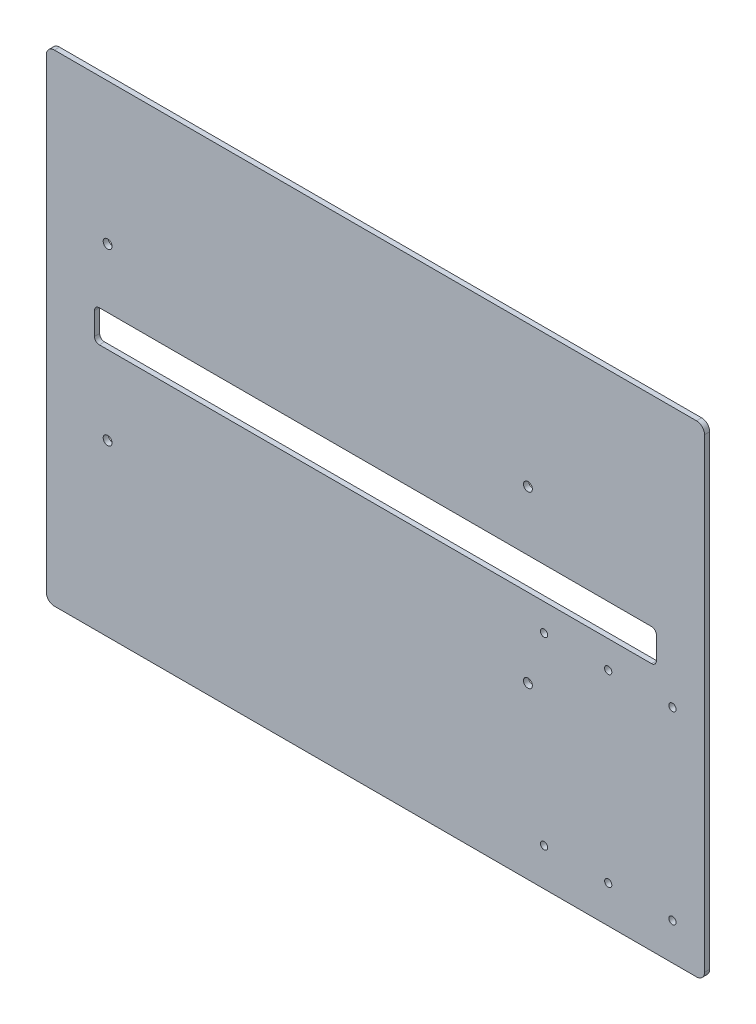
ISO-10303-21;
HEADER;
FILE_DESCRIPTION(('STEP AP214'),'2;1');
FILE_NAME('part.step','',(''),(''),'','','');
FILE_SCHEMA(('AUTOMOTIVE_DESIGN { 1 0 10303 214 1 1 1 1 }'));
ENDSEC;
DATA;
#1=APPLICATION_CONTEXT('core data for automotive mechanical design processes');
#2=APPLICATION_PROTOCOL_DEFINITION('international standard','automotive_design',2000,#1);
#3=PRODUCT_CONTEXT('',#1,'mechanical');
#4=PRODUCT('Part','Part','',(#3));
#5=PRODUCT_RELATED_PRODUCT_CATEGORY('part','',(#4));
#6=PRODUCT_DEFINITION_FORMATION('','',#4);
#7=PRODUCT_DEFINITION_CONTEXT('part definition',#1,'design');
#8=PRODUCT_DEFINITION('design','',#6,#7);
#9=PRODUCT_DEFINITION_SHAPE('','',#8);
#10=(LENGTH_UNIT() NAMED_UNIT(*) SI_UNIT(.MILLI.,.METRE.));
#11=(NAMED_UNIT(*) PLANE_ANGLE_UNIT() SI_UNIT($,.RADIAN.));
#12=(NAMED_UNIT(*) SI_UNIT($,.STERADIAN.) SOLID_ANGLE_UNIT());
#13=UNCERTAINTY_MEASURE_WITH_UNIT(LENGTH_MEASURE(1.E-05),#10,'distance_accuracy_value','');
#14=(GEOMETRIC_REPRESENTATION_CONTEXT(3) GLOBAL_UNCERTAINTY_ASSIGNED_CONTEXT((#13)) GLOBAL_UNIT_ASSIGNED_CONTEXT((#10,
#11,#12)) REPRESENTATION_CONTEXT('',''));
#15=CARTESIAN_POINT('',(0.,0.,0.));
#16=DIRECTION('',(0.,0.,1.));
#17=DIRECTION('',(1.,0.,0.));
#18=AXIS2_PLACEMENT_3D('',#15,#16,#17);
#19=CARTESIAN_POINT('',(5.,5.,3.2));
#20=DIRECTION('',(0.,0.,-1.));
#21=DIRECTION('',(-1.,0.,0.));
#22=AXIS2_PLACEMENT_3D('',#19,#20,#21);
#23=PLANE('',#22);
#24=CARTESIAN_POINT('',(300.,212.,3.2));
#25=DIRECTION('',(0.,0.,1.));
#26=DIRECTION('',(1.,0.,0.));
#27=AXIS2_PLACEMENT_3D('',#24,#25,#26);
#28=CIRCLE('',#27,2.74999999999998);
#29=CARTESIAN_POINT('',(302.75,212.,3.2));
#30=VERTEX_POINT('',#29);
#31=EDGE_CURVE('E246',#30,#30,#28,.T.);
#32=ORIENTED_EDGE('',*,*,#31,.F.);
#33=EDGE_LOOP('',(#32));
#34=FACE_BOUND('',#33,.T.);
#35=CARTESIAN_POINT('',(38.17,212.,3.2));
#36=DIRECTION('',(0.,0.,1.));
#37=DIRECTION('',(1.,0.,0.));
#38=AXIS2_PLACEMENT_3D('',#35,#36,#37);
#39=CIRCLE('',#38,2.75);
#40=CARTESIAN_POINT('',(40.92,212.,3.2));
#41=VERTEX_POINT('',#40);
#42=EDGE_CURVE('E253',#41,#41,#39,.T.);
#43=ORIENTED_EDGE('',*,*,#42,.F.);
#44=EDGE_LOOP('',(#43));
#45=FACE_BOUND('',#44,.T.);
#46=CARTESIAN_POINT('',(38.17,106.,3.2));
#47=DIRECTION('',(0.,0.,1.));
#48=DIRECTION('',(1.,0.,0.));
#49=AXIS2_PLACEMENT_3D('',#46,#47,#48);
#50=CIRCLE('',#49,2.75);
#51=CARTESIAN_POINT('',(40.92,106.,3.2));
#52=VERTEX_POINT('',#51);
#53=EDGE_CURVE('E261',#52,#52,#50,.T.);
#54=ORIENTED_EDGE('',*,*,#53,.F.);
#55=EDGE_LOOP('',(#54));
#56=FACE_BOUND('',#55,.T.);
#57=CARTESIAN_POINT('',(300.,106.,3.2));
#58=DIRECTION('',(0.,0.,1.));
#59=DIRECTION('',(1.,0.,0.));
#60=AXIS2_PLACEMENT_3D('',#57,#58,#59);
#61=CIRCLE('',#60,2.74999999999998);
#62=CARTESIAN_POINT('',(302.75,106.,3.2));
#63=VERTEX_POINT('',#62);
#64=EDGE_CURVE('E269',#63,#63,#61,.T.);
#65=ORIENTED_EDGE('',*,*,#64,.F.);
#66=EDGE_LOOP('',(#65));
#67=FACE_BOUND('',#66,.T.);
#68=CARTESIAN_POINT('',(390.,137.974344645562,3.2));
#69=DIRECTION('',(0.,0.,1.));
#70=DIRECTION('',(1.,0.,0.));
#71=AXIS2_PLACEMENT_3D('',#68,#69,#70);
#72=CIRCLE('',#71,2.24999999999996);
#73=CARTESIAN_POINT('',(392.25,137.974344645562,3.2));
#74=VERTEX_POINT('',#73);
#75=EDGE_CURVE('E277',#74,#74,#72,.T.);
#76=ORIENTED_EDGE('',*,*,#75,.F.);
#77=EDGE_LOOP('',(#76));
#78=FACE_BOUND('',#77,.T.);
#79=CARTESIAN_POINT('',(350.,137.974344645562,3.2));
#80=DIRECTION('',(0.,0.,1.));
#81=DIRECTION('',(1.,0.,0.));
#82=AXIS2_PLACEMENT_3D('',#79,#80,#81);
#83=CIRCLE('',#82,2.24999999999996);
#84=CARTESIAN_POINT('',(352.25,137.974344645562,3.2));
#85=VERTEX_POINT('',#84);
#86=EDGE_CURVE('E285',#85,#85,#83,.T.);
#87=ORIENTED_EDGE('',*,*,#86,.F.);
#88=EDGE_LOOP('',(#87));
#89=FACE_BOUND('',#88,.T.);
#90=CARTESIAN_POINT('',(310.,137.974344645562,3.2));
#91=DIRECTION('',(0.,0.,1.));
#92=DIRECTION('',(1.,0.,0.));
#93=AXIS2_PLACEMENT_3D('',#90,#91,#92);
#94=CIRCLE('',#93,2.24999999999996);
#95=CARTESIAN_POINT('',(312.25,137.974344645562,3.2));
#96=VERTEX_POINT('',#95);
#97=EDGE_CURVE('E293',#96,#96,#94,.T.);
#98=ORIENTED_EDGE('',*,*,#97,.F.);
#99=EDGE_LOOP('',(#98));
#100=FACE_BOUND('',#99,.T.);
#101=CARTESIAN_POINT('',(390.,22.9743446455618,3.2));
#102=DIRECTION('',(0.,0.,1.));
#103=DIRECTION('',(1.,0.,0.));
#104=AXIS2_PLACEMENT_3D('',#101,#102,#103);
#105=CIRCLE('',#104,2.24999999999995);
#106=CARTESIAN_POINT('',(392.25,22.9743446455618,3.2));
#107=VERTEX_POINT('',#106);
#108=EDGE_CURVE('E301',#107,#107,#105,.T.);
#109=ORIENTED_EDGE('',*,*,#108,.F.);
#110=EDGE_LOOP('',(#109));
#111=FACE_BOUND('',#110,.T.);
#112=CARTESIAN_POINT('',(350.,23.1568874107764,3.2));
#113=DIRECTION('',(0.,0.,1.));
#114=DIRECTION('',(1.,0.,0.));
#115=AXIS2_PLACEMENT_3D('',#112,#113,#114);
#116=CIRCLE('',#115,2.24999999999995);
#117=CARTESIAN_POINT('',(352.25,23.1568874107764,3.2));
#118=VERTEX_POINT('',#117);
#119=EDGE_CURVE('E308',#118,#118,#116,.T.);
#120=ORIENTED_EDGE('',*,*,#119,.F.);
#121=EDGE_LOOP('',(#120));
#122=FACE_BOUND('',#121,.T.);
#123=CARTESIAN_POINT('',(310.,23.3394301759909,3.2));
#124=DIRECTION('',(0.,0.,1.));
#125=DIRECTION('',(1.,0.,0.));
#126=AXIS2_PLACEMENT_3D('',#123,#124,#125);
#127=CIRCLE('',#126,2.24999999999995);
#128=CARTESIAN_POINT('',(312.25,23.3394301759909,3.2));
#129=VERTEX_POINT('',#128);
#130=EDGE_CURVE('E316',#129,#129,#127,.T.);
#131=ORIENTED_EDGE('',*,*,#130,.F.);
#132=EDGE_LOOP('',(#131));
#133=FACE_BOUND('',#132,.T.);
#134=CARTESIAN_POINT('',(5.,5.,3.2));
#135=DIRECTION('',(0.,0.,1.));
#136=DIRECTION('',(-1.,0.,0.));
#137=AXIS2_PLACEMENT_3D('',#134,#135,#136);
#138=CIRCLE('',#137,5.);
#139=CARTESIAN_POINT('',(0.,5.00000000000004,3.2));
#140=VERTEX_POINT('',#139);
#141=CARTESIAN_POINT('',(5.00000000000003,0.,3.2));
#142=VERTEX_POINT('',#141);
#143=EDGE_CURVE('E324',#140,#142,#138,.T.);
#144=ORIENTED_EDGE('',*,*,#143,.T.);
#145=DIRECTION('',(1.,0.,0.));
#146=VECTOR('',#145,1.);
#147=CARTESIAN_POINT('',(5.00000000000003,0.,3.2));
#148=LINE('',#147,#146);
#149=CARTESIAN_POINT('',(405.,0.,3.2));
#150=VERTEX_POINT('',#149);
#151=EDGE_CURVE('E328',#142,#150,#148,.T.);
#152=ORIENTED_EDGE('',*,*,#151,.T.);
#153=CARTESIAN_POINT('',(405.,5.,3.2));
#154=DIRECTION('',(0.,0.,1.));
#155=DIRECTION('',(1.,0.,0.));
#156=AXIS2_PLACEMENT_3D('',#153,#154,#155);
#157=CIRCLE('',#156,5.);
#158=CARTESIAN_POINT('',(410.,5.,3.2));
#159=VERTEX_POINT('',#158);
#160=EDGE_CURVE('E332',#150,#159,#157,.T.);
#161=ORIENTED_EDGE('',*,*,#160,.T.);
#162=DIRECTION('',(0.,1.,0.));
#163=VECTOR('',#162,1.);
#164=CARTESIAN_POINT('',(410.,5.00000000000004,3.2));
#165=LINE('',#164,#163);
#166=CARTESIAN_POINT('',(410.,295.,3.2));
#167=VERTEX_POINT('',#166);
#168=EDGE_CURVE('E335',#159,#167,#165,.T.);
#169=ORIENTED_EDGE('',*,*,#168,.T.);
#170=CARTESIAN_POINT('',(405.,295.,3.2));
#171=DIRECTION('',(0.,0.,1.));
#172=DIRECTION('',(-1.,0.,0.));
#173=AXIS2_PLACEMENT_3D('',#170,#171,#172);
#174=CIRCLE('',#173,5.);
#175=CARTESIAN_POINT('',(405.,300.,3.2));
#176=VERTEX_POINT('',#175);
#177=EDGE_CURVE('E338',#167,#176,#174,.T.);
#178=ORIENTED_EDGE('',*,*,#177,.T.);
#179=DIRECTION('',(-1.,0.,0.));
#180=VECTOR('',#179,1.);
#181=CARTESIAN_POINT('',(5.00000000000003,300.,3.2));
#182=LINE('',#181,#180);
#183=CARTESIAN_POINT('',(5.00000000000003,300.,3.2));
#184=VERTEX_POINT('',#183);
#185=EDGE_CURVE('E341',#176,#184,#182,.T.);
#186=ORIENTED_EDGE('',*,*,#185,.T.);
#187=CARTESIAN_POINT('',(5.,295.,3.2));
#188=DIRECTION('',(0.,0.,1.));
#189=DIRECTION('',(-1.,0.,0.));
#190=AXIS2_PLACEMENT_3D('',#187,#188,#189);
#191=CIRCLE('',#190,5.);
#192=CARTESIAN_POINT('',(0.,295.,3.2));
#193=VERTEX_POINT('',#192);
#194=EDGE_CURVE('E344',#184,#193,#191,.T.);
#195=ORIENTED_EDGE('',*,*,#194,.T.);
#196=DIRECTION('',(0.,-1.,0.));
#197=VECTOR('',#196,1.);
#198=CARTESIAN_POINT('',(0.,5.00000000000004,3.2));
#199=LINE('',#198,#197);
#200=EDGE_CURVE('E347',#193,#140,#199,.T.);
#201=ORIENTED_EDGE('',*,*,#200,.T.);
#202=EDGE_LOOP('',(#144,#152,#161,#169,#178,#186,#195,#201));
#203=FACE_BOUND('',#202,.T.);
#204=CARTESIAN_POINT('',(377.,158.,3.2));
#205=DIRECTION('',(0.,0.,1.));
#206=DIRECTION('',(1.,0.,0.));
#207=AXIS2_PLACEMENT_3D('',#204,#205,#206);
#208=CIRCLE('',#207,3.);
#209=CARTESIAN_POINT('',(377.,155.,3.2));
#210=VERTEX_POINT('',#209);
#211=CARTESIAN_POINT('',(380.,158.,3.2));
#212=VERTEX_POINT('',#211);
#213=EDGE_CURVE('E154',#210,#212,#208,.T.);
#214=ORIENTED_EDGE('',*,*,#213,.F.);
#215=DIRECTION('',(1.,0.,0.));
#216=VECTOR('',#215,1.);
#217=CARTESIAN_POINT('',(33.,155.,3.2));
#218=LINE('',#217,#216);
#219=CARTESIAN_POINT('',(33.,155.,3.2));
#220=VERTEX_POINT('',#219);
#221=EDGE_CURVE('E198',#220,#210,#218,.T.);
#222=ORIENTED_EDGE('',*,*,#221,.F.);
#223=CARTESIAN_POINT('',(33.,158.,3.2));
#224=DIRECTION('',(0.,0.,1.));
#225=DIRECTION('',(-1.,0.,0.));
#226=AXIS2_PLACEMENT_3D('',#223,#224,#225);
#227=CIRCLE('',#226,3.);
#228=CARTESIAN_POINT('',(30.,158.,3.2));
#229=VERTEX_POINT('',#228);
#230=EDGE_CURVE('E195',#229,#220,#227,.T.);
#231=ORIENTED_EDGE('',*,*,#230,.F.);
#232=DIRECTION('',(0.,-1.,0.));
#233=VECTOR('',#232,1.);
#234=CARTESIAN_POINT('',(30.,158.,3.2));
#235=LINE('',#234,#233);
#236=CARTESIAN_POINT('',(30.,172.,3.2));
#237=VERTEX_POINT('',#236);
#238=EDGE_CURVE('E192',#237,#229,#235,.T.);
#239=ORIENTED_EDGE('',*,*,#238,.F.);
#240=CARTESIAN_POINT('',(33.,172.,3.2));
#241=DIRECTION('',(0.,0.,1.));
#242=DIRECTION('',(-1.,0.,0.));
#243=AXIS2_PLACEMENT_3D('',#240,#241,#242);
#244=CIRCLE('',#243,3.);
#245=CARTESIAN_POINT('',(33.,175.,3.2));
#246=VERTEX_POINT('',#245);
#247=EDGE_CURVE('E189',#246,#237,#244,.T.);
#248=ORIENTED_EDGE('',*,*,#247,.F.);
#249=DIRECTION('',(-1.,0.,0.));
#250=VECTOR('',#249,1.);
#251=CARTESIAN_POINT('',(33.,175.,3.2));
#252=LINE('',#251,#250);
#253=CARTESIAN_POINT('',(377.,175.,3.2));
#254=VERTEX_POINT('',#253);
#255=EDGE_CURVE('E184',#254,#246,#252,.T.);
#256=ORIENTED_EDGE('',*,*,#255,.F.);
#257=CARTESIAN_POINT('',(377.,172.,3.2));
#258=DIRECTION('',(0.,0.,1.));
#259=DIRECTION('',(-1.,0.,0.));
#260=AXIS2_PLACEMENT_3D('',#257,#258,#259);
#261=CIRCLE('',#260,3.);
#262=CARTESIAN_POINT('',(380.,172.,3.2));
#263=VERTEX_POINT('',#262);
#264=EDGE_CURVE('E177',#263,#254,#261,.T.);
#265=ORIENTED_EDGE('',*,*,#264,.F.);
#266=DIRECTION('',(0.,1.,0.));
#267=VECTOR('',#266,1.);
#268=CARTESIAN_POINT('',(380.,158.,3.2));
#269=LINE('',#268,#267);
#270=EDGE_CURVE('E163',#212,#263,#269,.T.);
#271=ORIENTED_EDGE('',*,*,#270,.F.);
#272=EDGE_LOOP('',(#214,#222,#231,#239,#248,#256,#265,#271));
#273=FACE_BOUND('',#272,.T.);
#274=ADVANCED_FACE('F40',(#34,#45,#56,#67,#78,#89,#100,#111,#122,#133,#203,#273),#23,.F.);
#275=CARTESIAN_POINT('',(5.,5.,0.));
#276=DIRECTION('',(0.,0.,-1.));
#277=DIRECTION('',(-1.,0.,0.));
#278=AXIS2_PLACEMENT_3D('',#275,#276,#277);
#279=PLANE('',#278);
#280=CARTESIAN_POINT('',(38.17,212.,0.));
#281=DIRECTION('',(0.,0.,1.));
#282=DIRECTION('',(1.,0.,0.));
#283=AXIS2_PLACEMENT_3D('',#280,#281,#282);
#284=CIRCLE('',#283,2.75);
#285=CARTESIAN_POINT('',(40.92,212.,0.));
#286=VERTEX_POINT('',#285);
#287=EDGE_CURVE('E249',#286,#286,#284,.T.);
#288=ORIENTED_EDGE('',*,*,#287,.T.);
#289=EDGE_LOOP('',(#288));
#290=FACE_BOUND('',#289,.T.);
#291=CARTESIAN_POINT('',(300.,106.,0.));
#292=DIRECTION('',(0.,0.,1.));
#293=DIRECTION('',(1.,0.,0.));
#294=AXIS2_PLACEMENT_3D('',#291,#292,#293);
#295=CIRCLE('',#294,2.74999999999998);
#296=CARTESIAN_POINT('',(302.75,106.,0.));
#297=VERTEX_POINT('',#296);
#298=EDGE_CURVE('E265',#297,#297,#295,.T.);
#299=ORIENTED_EDGE('',*,*,#298,.T.);
#300=EDGE_LOOP('',(#299));
#301=FACE_BOUND('',#300,.T.);
#302=CARTESIAN_POINT('',(350.,137.974344645562,0.));
#303=DIRECTION('',(0.,0.,1.));
#304=DIRECTION('',(1.,0.,0.));
#305=AXIS2_PLACEMENT_3D('',#302,#303,#304);
#306=CIRCLE('',#305,2.24999999999996);
#307=CARTESIAN_POINT('',(352.25,137.974344645562,0.));
#308=VERTEX_POINT('',#307);
#309=EDGE_CURVE('E281',#308,#308,#306,.T.);
#310=ORIENTED_EDGE('',*,*,#309,.T.);
#311=EDGE_LOOP('',(#310));
#312=FACE_BOUND('',#311,.T.);
#313=CARTESIAN_POINT('',(390.,22.9743446455618,0.));
#314=DIRECTION('',(0.,0.,1.));
#315=DIRECTION('',(1.,0.,0.));
#316=AXIS2_PLACEMENT_3D('',#313,#314,#315);
#317=CIRCLE('',#316,2.24999999999995);
#318=CARTESIAN_POINT('',(392.25,22.9743446455618,0.));
#319=VERTEX_POINT('',#318);
#320=EDGE_CURVE('E297',#319,#319,#317,.T.);
#321=ORIENTED_EDGE('',*,*,#320,.T.);
#322=EDGE_LOOP('',(#321));
#323=FACE_BOUND('',#322,.T.);
#324=CARTESIAN_POINT('',(310.,23.3394301759909,0.));
#325=DIRECTION('',(0.,0.,1.));
#326=DIRECTION('',(1.,0.,0.));
#327=AXIS2_PLACEMENT_3D('',#324,#325,#326);
#328=CIRCLE('',#327,2.24999999999995);
#329=CARTESIAN_POINT('',(312.25,23.3394301759909,0.));
#330=VERTEX_POINT('',#329);
#331=EDGE_CURVE('E312',#330,#330,#328,.T.);
#332=ORIENTED_EDGE('',*,*,#331,.T.);
#333=EDGE_LOOP('',(#332));
#334=FACE_BOUND('',#333,.T.);
#335=CARTESIAN_POINT('',(5.,5.,0.));
#336=DIRECTION('',(0.,0.,1.));
#337=DIRECTION('',(-1.,0.,0.));
#338=AXIS2_PLACEMENT_3D('',#335,#336,#337);
#339=CIRCLE('',#338,5.);
#340=CARTESIAN_POINT('',(0.,5.00000000000004,0.));
#341=VERTEX_POINT('',#340);
#342=CARTESIAN_POINT('',(5.00000000000003,0.,0.));
#343=VERTEX_POINT('',#342);
#344=EDGE_CURVE('E320',#341,#343,#339,.T.);
#345=ORIENTED_EDGE('',*,*,#344,.F.);
#346=DIRECTION('',(0.,-1.,0.));
#347=VECTOR('',#346,1.);
#348=CARTESIAN_POINT('',(0.,5.00000000000004,0.));
#349=LINE('',#348,#347);
#350=CARTESIAN_POINT('',(0.,295.,0.));
#351=VERTEX_POINT('',#350);
#352=EDGE_CURVE('E329',#351,#341,#349,.T.);
#353=ORIENTED_EDGE('',*,*,#352,.F.);
#354=CARTESIAN_POINT('',(5.,295.,0.));
#355=DIRECTION('',(0.,0.,1.));
#356=DIRECTION('',(-1.,0.,0.));
#357=AXIS2_PLACEMENT_3D('',#354,#355,#356);
#358=CIRCLE('',#357,5.);
#359=CARTESIAN_POINT('',(5.00000000000003,300.,0.));
#360=VERTEX_POINT('',#359);
#361=EDGE_CURVE('E369',#360,#351,#358,.T.);
#362=ORIENTED_EDGE('',*,*,#361,.F.);
#363=DIRECTION('',(-1.,0.,0.));
#364=VECTOR('',#363,1.);
#365=CARTESIAN_POINT('',(5.00000000000003,300.,0.));
#366=LINE('',#365,#364);
#367=CARTESIAN_POINT('',(405.,300.,0.));
#368=VERTEX_POINT('',#367);
#369=EDGE_CURVE('E366',#368,#360,#366,.T.);
#370=ORIENTED_EDGE('',*,*,#369,.F.);
#371=CARTESIAN_POINT('',(405.,295.,0.));
#372=DIRECTION('',(0.,0.,1.));
#373=DIRECTION('',(-1.,0.,0.));
#374=AXIS2_PLACEMENT_3D('',#371,#372,#373);
#375=CIRCLE('',#374,5.);
#376=CARTESIAN_POINT('',(410.,295.,0.));
#377=VERTEX_POINT('',#376);
#378=EDGE_CURVE('E363',#377,#368,#375,.T.);
#379=ORIENTED_EDGE('',*,*,#378,.F.);
#380=DIRECTION('',(0.,1.,0.));
#381=VECTOR('',#380,1.);
#382=CARTESIAN_POINT('',(410.,5.00000000000004,0.));
#383=LINE('',#382,#381);
#384=CARTESIAN_POINT('',(410.,5.,0.));
#385=VERTEX_POINT('',#384);
#386=EDGE_CURVE('E360',#385,#377,#383,.T.);
#387=ORIENTED_EDGE('',*,*,#386,.F.);
#388=CARTESIAN_POINT('',(405.,5.,0.));
#389=DIRECTION('',(0.,0.,1.));
#390=DIRECTION('',(1.,0.,0.));
#391=AXIS2_PLACEMENT_3D('',#388,#389,#390);
#392=CIRCLE('',#391,5.);
#393=CARTESIAN_POINT('',(405.,0.,0.));
#394=VERTEX_POINT('',#393);
#395=EDGE_CURVE('E357',#394,#385,#392,.T.);
#396=ORIENTED_EDGE('',*,*,#395,.F.);
#397=DIRECTION('',(1.,0.,0.));
#398=VECTOR('',#397,1.);
#399=CARTESIAN_POINT('',(5.00000000000003,0.,0.));
#400=LINE('',#399,#398);
#401=EDGE_CURVE('E354',#343,#394,#400,.T.);
#402=ORIENTED_EDGE('',*,*,#401,.F.);
#403=EDGE_LOOP('',(#345,#353,#362,#370,#379,#387,#396,#402));
#404=FACE_BOUND('',#403,.T.);
#405=CARTESIAN_POINT('',(350.,23.1568874107764,0.));
#406=DIRECTION('',(0.,0.,1.));
#407=DIRECTION('',(1.,0.,0.));
#408=AXIS2_PLACEMENT_3D('',#405,#406,#407);
#409=CIRCLE('',#408,2.24999999999995);
#410=CARTESIAN_POINT('',(352.25,23.1568874107764,0.));
#411=VERTEX_POINT('',#410);
#412=EDGE_CURVE('E305',#411,#411,#409,.T.);
#413=ORIENTED_EDGE('',*,*,#412,.T.);
#414=EDGE_LOOP('',(#413));
#415=FACE_BOUND('',#414,.T.);
#416=CARTESIAN_POINT('',(310.,137.974344645562,0.));
#417=DIRECTION('',(0.,0.,1.));
#418=DIRECTION('',(1.,0.,0.));
#419=AXIS2_PLACEMENT_3D('',#416,#417,#418);
#420=CIRCLE('',#419,2.24999999999996);
#421=CARTESIAN_POINT('',(312.25,137.974344645562,0.));
#422=VERTEX_POINT('',#421);
#423=EDGE_CURVE('E289',#422,#422,#420,.T.);
#424=ORIENTED_EDGE('',*,*,#423,.T.);
#425=EDGE_LOOP('',(#424));
#426=FACE_BOUND('',#425,.T.);
#427=CARTESIAN_POINT('',(390.,137.974344645562,0.));
#428=DIRECTION('',(0.,0.,1.));
#429=DIRECTION('',(1.,0.,0.));
#430=AXIS2_PLACEMENT_3D('',#427,#428,#429);
#431=CIRCLE('',#430,2.24999999999996);
#432=CARTESIAN_POINT('',(392.25,137.974344645562,0.));
#433=VERTEX_POINT('',#432);
#434=EDGE_CURVE('E273',#433,#433,#431,.T.);
#435=ORIENTED_EDGE('',*,*,#434,.T.);
#436=EDGE_LOOP('',(#435));
#437=FACE_BOUND('',#436,.T.);
#438=CARTESIAN_POINT('',(38.17,106.,0.));
#439=DIRECTION('',(0.,0.,1.));
#440=DIRECTION('',(1.,0.,0.));
#441=AXIS2_PLACEMENT_3D('',#438,#439,#440);
#442=CIRCLE('',#441,2.75);
#443=CARTESIAN_POINT('',(40.92,106.,0.));
#444=VERTEX_POINT('',#443);
#445=EDGE_CURVE('E257',#444,#444,#442,.T.);
#446=ORIENTED_EDGE('',*,*,#445,.T.);
#447=EDGE_LOOP('',(#446));
#448=FACE_BOUND('',#447,.T.);
#449=CARTESIAN_POINT('',(300.,212.,0.));
#450=DIRECTION('',(0.,0.,1.));
#451=DIRECTION('',(1.,0.,0.));
#452=AXIS2_PLACEMENT_3D('',#449,#450,#451);
#453=CIRCLE('',#452,2.74999999999998);
#454=CARTESIAN_POINT('',(302.75,212.,0.));
#455=VERTEX_POINT('',#454);
#456=EDGE_CURVE('E172',#455,#455,#453,.T.);
#457=ORIENTED_EDGE('',*,*,#456,.T.);
#458=EDGE_LOOP('',(#457));
#459=FACE_BOUND('',#458,.T.);
#460=DIRECTION('',(1.,0.,0.));
#461=VECTOR('',#460,1.);
#462=CARTESIAN_POINT('',(33.,155.,0.));
#463=LINE('',#462,#461);
#464=CARTESIAN_POINT('',(33.,155.,0.));
#465=VERTEX_POINT('',#464);
#466=CARTESIAN_POINT('',(377.,155.,0.));
#467=VERTEX_POINT('',#466);
#468=EDGE_CURVE('E164',#465,#467,#463,.T.);
#469=ORIENTED_EDGE('',*,*,#468,.T.);
#470=CARTESIAN_POINT('',(377.,158.,0.));
#471=DIRECTION('',(0.,0.,1.));
#472=DIRECTION('',(1.,0.,0.));
#473=AXIS2_PLACEMENT_3D('',#470,#471,#472);
#474=CIRCLE('',#473,3.);
#475=CARTESIAN_POINT('',(380.,158.,0.));
#476=VERTEX_POINT('',#475);
#477=EDGE_CURVE('E64',#467,#476,#474,.T.);
#478=ORIENTED_EDGE('',*,*,#477,.T.);
#479=DIRECTION('',(0.,1.,0.));
#480=VECTOR('',#479,1.);
#481=CARTESIAN_POINT('',(380.,158.,0.));
#482=LINE('',#481,#480);
#483=CARTESIAN_POINT('',(380.,172.,0.));
#484=VERTEX_POINT('',#483);
#485=EDGE_CURVE('E170',#476,#484,#482,.T.);
#486=ORIENTED_EDGE('',*,*,#485,.T.);
#487=CARTESIAN_POINT('',(377.,172.,0.));
#488=DIRECTION('',(0.,0.,1.));
#489=DIRECTION('',(-1.,0.,0.));
#490=AXIS2_PLACEMENT_3D('',#487,#488,#489);
#491=CIRCLE('',#490,3.);
#492=CARTESIAN_POINT('',(377.,175.,0.));
#493=VERTEX_POINT('',#492);
#494=EDGE_CURVE('E205',#484,#493,#491,.T.);
#495=ORIENTED_EDGE('',*,*,#494,.T.);
#496=DIRECTION('',(-1.,0.,0.));
#497=VECTOR('',#496,1.);
#498=CARTESIAN_POINT('',(33.,175.,0.));
#499=LINE('',#498,#497);
#500=CARTESIAN_POINT('',(33.,175.,0.));
#501=VERTEX_POINT('',#500);
#502=EDGE_CURVE('E209',#493,#501,#499,.T.);
#503=ORIENTED_EDGE('',*,*,#502,.T.);
#504=CARTESIAN_POINT('',(33.,172.,0.));
#505=DIRECTION('',(0.,0.,1.));
#506=DIRECTION('',(-1.,0.,0.));
#507=AXIS2_PLACEMENT_3D('',#504,#505,#506);
#508=CIRCLE('',#507,3.);
#509=CARTESIAN_POINT('',(30.,172.,0.));
#510=VERTEX_POINT('',#509);
#511=EDGE_CURVE('E213',#501,#510,#508,.T.);
#512=ORIENTED_EDGE('',*,*,#511,.T.);
#513=DIRECTION('',(0.,-1.,0.));
#514=VECTOR('',#513,1.);
#515=CARTESIAN_POINT('',(30.,158.,0.));
#516=LINE('',#515,#514);
#517=CARTESIAN_POINT('',(30.,158.,0.));
#518=VERTEX_POINT('',#517);
#519=EDGE_CURVE('E217',#510,#518,#516,.T.);
#520=ORIENTED_EDGE('',*,*,#519,.T.);
#521=CARTESIAN_POINT('',(33.,158.,0.));
#522=DIRECTION('',(0.,0.,1.));
#523=DIRECTION('',(-1.,0.,0.));
#524=AXIS2_PLACEMENT_3D('',#521,#522,#523);
#525=CIRCLE('',#524,3.);
#526=EDGE_CURVE('E221',#518,#465,#525,.T.);
#527=ORIENTED_EDGE('',*,*,#526,.T.);
#528=EDGE_LOOP('',(#469,#478,#486,#495,#503,#512,#520,#527));
#529=FACE_BOUND('',#528,.T.);
#530=ADVANCED_FACE('F409',(#290,#301,#312,#323,#334,#404,#415,#426,#437,#448,#459,#529),#279,.T.);
#531=CARTESIAN_POINT('',(5.,5.,3.2));
#532=DIRECTION('',(0.,0.,-1.));
#533=DIRECTION('',(-1.,0.,0.));
#534=AXIS2_PLACEMENT_3D('',#531,#532,#533);
#535=CYLINDRICAL_SURFACE('',#534,5.);
#536=ORIENTED_EDGE('',*,*,#344,.T.);
#537=DIRECTION('',(0.,0.,-1.));
#538=VECTOR('',#537,1.);
#539=CARTESIAN_POINT('',(5.00000000000003,0.,3.2));
#540=LINE('',#539,#538);
#541=EDGE_CURVE('E11',#142,#343,#540,.T.);
#542=ORIENTED_EDGE('',*,*,#541,.F.);
#543=ORIENTED_EDGE('',*,*,#143,.F.);
#544=DIRECTION('',(0.,0.,-1.));
#545=VECTOR('',#544,1.);
#546=CARTESIAN_POINT('',(0.,5.00000000000004,3.2));
#547=LINE('',#546,#545);
#548=EDGE_CURVE('E350',#140,#341,#547,.T.);
#549=ORIENTED_EDGE('',*,*,#548,.T.);
#550=EDGE_LOOP('',(#536,#542,#543,#549));
#551=FACE_BOUND('',#550,.T.);
#552=ADVANCED_FACE('F42',(#551),#535,.T.);
#553=CARTESIAN_POINT('',(5.00000000000003,0.,3.2));
#554=DIRECTION('',(0.,1.,0.));
#555=DIRECTION('',(0.,0.,1.));
#556=AXIS2_PLACEMENT_3D('',#553,#554,#555);
#557=PLANE('',#556);
#558=ORIENTED_EDGE('',*,*,#401,.T.);
#559=DIRECTION('',(0.,0.,-1.));
#560=VECTOR('',#559,1.);
#561=CARTESIAN_POINT('',(405.,0.,3.2));
#562=LINE('',#561,#560);
#563=EDGE_CURVE('E49',#150,#394,#562,.T.);
#564=ORIENTED_EDGE('',*,*,#563,.F.);
#565=ORIENTED_EDGE('',*,*,#151,.F.);
#566=ORIENTED_EDGE('',*,*,#541,.T.);
#567=EDGE_LOOP('',(#558,#564,#565,#566));
#568=FACE_BOUND('',#567,.T.);
#569=ADVANCED_FACE('F426',(#568),#557,.F.);
#570=CARTESIAN_POINT('',(405.,5.,3.2));
#571=DIRECTION('',(0.,0.,-1.));
#572=DIRECTION('',(-1.,0.,0.));
#573=AXIS2_PLACEMENT_3D('',#570,#571,#572);
#574=CYLINDRICAL_SURFACE('',#573,5.);
#575=ORIENTED_EDGE('',*,*,#395,.T.);
#576=DIRECTION('',(0.,0.,-1.));
#577=VECTOR('',#576,1.);
#578=CARTESIAN_POINT('',(410.,5.,3.2));
#579=LINE('',#578,#577);
#580=EDGE_CURVE('E393',#159,#385,#579,.T.);
#581=ORIENTED_EDGE('',*,*,#580,.F.);
#582=ORIENTED_EDGE('',*,*,#160,.F.);
#583=ORIENTED_EDGE('',*,*,#563,.T.);
#584=EDGE_LOOP('',(#575,#581,#582,#583));
#585=FACE_BOUND('',#584,.T.);
#586=ADVANCED_FACE('F403',(#585),#574,.T.);
#587=CARTESIAN_POINT('',(410.,5.00000000000004,3.2));
#588=DIRECTION('',(-1.,0.,0.));
#589=DIRECTION('',(0.,0.,1.));
#590=AXIS2_PLACEMENT_3D('',#587,#588,#589);
#591=PLANE('',#590);
#592=ORIENTED_EDGE('',*,*,#386,.T.);
#593=DIRECTION('',(0.,0.,-1.));
#594=VECTOR('',#593,1.);
#595=CARTESIAN_POINT('',(410.,295.,3.2));
#596=LINE('',#595,#594);
#597=EDGE_CURVE('E389',#167,#377,#596,.T.);
#598=ORIENTED_EDGE('',*,*,#597,.F.);
#599=ORIENTED_EDGE('',*,*,#168,.F.);
#600=ORIENTED_EDGE('',*,*,#580,.T.);
#601=EDGE_LOOP('',(#592,#598,#599,#600));
#602=FACE_BOUND('',#601,.T.);
#603=ADVANCED_FACE('F415',(#602),#591,.F.);
#604=CARTESIAN_POINT('',(405.,295.,3.2));
#605=DIRECTION('',(0.,0.,-1.));
#606=DIRECTION('',(-1.,0.,0.));
#607=AXIS2_PLACEMENT_3D('',#604,#605,#606);
#608=CYLINDRICAL_SURFACE('',#607,5.);
#609=ORIENTED_EDGE('',*,*,#378,.T.);
#610=DIRECTION('',(0.,0.,-1.));
#611=VECTOR('',#610,1.);
#612=CARTESIAN_POINT('',(405.,300.,3.2));
#613=LINE('',#612,#611);
#614=EDGE_CURVE('E385',#176,#368,#613,.T.);
#615=ORIENTED_EDGE('',*,*,#614,.F.);
#616=ORIENTED_EDGE('',*,*,#177,.F.);
#617=ORIENTED_EDGE('',*,*,#597,.T.);
#618=EDGE_LOOP('',(#609,#615,#616,#617));
#619=FACE_BOUND('',#618,.T.);
#620=ADVANCED_FACE('F419',(#619),#608,.T.);
#621=CARTESIAN_POINT('',(5.00000000000003,300.,3.2));
#622=DIRECTION('',(0.,-1.,0.));
#623=DIRECTION('',(0.,0.,-1.));
#624=AXIS2_PLACEMENT_3D('',#621,#622,#623);
#625=PLANE('',#624);
#626=ORIENTED_EDGE('',*,*,#369,.T.);
#627=DIRECTION('',(0.,0.,-1.));
#628=VECTOR('',#627,1.);
#629=CARTESIAN_POINT('',(5.00000000000003,300.,3.2));
#630=LINE('',#629,#628);
#631=EDGE_CURVE('E381',#184,#360,#630,.T.);
#632=ORIENTED_EDGE('',*,*,#631,.F.);
#633=ORIENTED_EDGE('',*,*,#185,.F.);
#634=ORIENTED_EDGE('',*,*,#614,.T.);
#635=EDGE_LOOP('',(#626,#632,#633,#634));
#636=FACE_BOUND('',#635,.T.);
#637=ADVANCED_FACE('F439',(#636),#625,.F.);
#638=CARTESIAN_POINT('',(5.,295.,3.2));
#639=DIRECTION('',(0.,0.,-1.));
#640=DIRECTION('',(-1.,0.,0.));
#641=AXIS2_PLACEMENT_3D('',#638,#639,#640);
#642=CYLINDRICAL_SURFACE('',#641,5.);
#643=ORIENTED_EDGE('',*,*,#361,.T.);
#644=DIRECTION('',(0.,0.,-1.));
#645=VECTOR('',#644,1.);
#646=CARTESIAN_POINT('',(0.,295.,3.2));
#647=LINE('',#646,#645);
#648=EDGE_CURVE('E377',#193,#351,#647,.T.);
#649=ORIENTED_EDGE('',*,*,#648,.F.);
#650=ORIENTED_EDGE('',*,*,#194,.F.);
#651=ORIENTED_EDGE('',*,*,#631,.T.);
#652=EDGE_LOOP('',(#643,#649,#650,#651));
#653=FACE_BOUND('',#652,.T.);
#654=ADVANCED_FACE('F437',(#653),#642,.T.);
#655=CARTESIAN_POINT('',(0.,5.00000000000004,3.2));
#656=DIRECTION('',(1.,0.,0.));
#657=DIRECTION('',(0.,0.,-1.));
#658=AXIS2_PLACEMENT_3D('',#655,#656,#657);
#659=PLANE('',#658);
#660=ORIENTED_EDGE('',*,*,#352,.T.);
#661=ORIENTED_EDGE('',*,*,#548,.F.);
#662=ORIENTED_EDGE('',*,*,#200,.F.);
#663=ORIENTED_EDGE('',*,*,#648,.T.);
#664=EDGE_LOOP('',(#660,#661,#662,#663));
#665=FACE_BOUND('',#664,.T.);
#666=ADVANCED_FACE('F432',(#665),#659,.F.);
#667=CARTESIAN_POINT('',(310.,23.3394301759909,3.2));
#668=DIRECTION('',(0.,0.,-1.));
#669=DIRECTION('',(-1.,0.,0.));
#670=AXIS2_PLACEMENT_3D('',#667,#668,#669);
#671=CYLINDRICAL_SURFACE('',#670,2.24999999999995);
#672=ORIENTED_EDGE('',*,*,#130,.T.);
#673=EDGE_LOOP('',(#672));
#674=FACE_BOUND('',#673,.T.);
#675=ORIENTED_EDGE('',*,*,#331,.F.);
#676=EDGE_LOOP('',(#675));
#677=FACE_BOUND('',#676,.T.);
#678=ADVANCED_FACE('F459',(#674,#677),#671,.F.);
#679=CARTESIAN_POINT('',(350.,23.1568874107764,3.2));
#680=DIRECTION('',(0.,0.,-1.));
#681=DIRECTION('',(-1.,0.,0.));
#682=AXIS2_PLACEMENT_3D('',#679,#680,#681);
#683=CYLINDRICAL_SURFACE('',#682,2.24999999999995);
#684=ORIENTED_EDGE('',*,*,#119,.T.);
#685=EDGE_LOOP('',(#684));
#686=FACE_BOUND('',#685,.T.);
#687=ORIENTED_EDGE('',*,*,#412,.F.);
#688=EDGE_LOOP('',(#687));
#689=FACE_BOUND('',#688,.T.);
#690=ADVANCED_FACE('F466',(#686,#689),#683,.F.);
#691=CARTESIAN_POINT('',(390.,22.9743446455618,3.2));
#692=DIRECTION('',(0.,0.,-1.));
#693=DIRECTION('',(-1.,0.,0.));
#694=AXIS2_PLACEMENT_3D('',#691,#692,#693);
#695=CYLINDRICAL_SURFACE('',#694,2.24999999999995);
#696=ORIENTED_EDGE('',*,*,#108,.T.);
#697=EDGE_LOOP('',(#696));
#698=FACE_BOUND('',#697,.T.);
#699=ORIENTED_EDGE('',*,*,#320,.F.);
#700=EDGE_LOOP('',(#699));
#701=FACE_BOUND('',#700,.T.);
#702=ADVANCED_FACE('F471',(#698,#701),#695,.F.);
#703=CARTESIAN_POINT('',(310.,137.974344645562,3.2));
#704=DIRECTION('',(0.,0.,-1.));
#705=DIRECTION('',(-1.,0.,0.));
#706=AXIS2_PLACEMENT_3D('',#703,#704,#705);
#707=CYLINDRICAL_SURFACE('',#706,2.24999999999996);
#708=ORIENTED_EDGE('',*,*,#97,.T.);
#709=EDGE_LOOP('',(#708));
#710=FACE_BOUND('',#709,.T.);
#711=ORIENTED_EDGE('',*,*,#423,.F.);
#712=EDGE_LOOP('',(#711));
#713=FACE_BOUND('',#712,.T.);
#714=ADVANCED_FACE('F481',(#710,#713),#707,.F.);
#715=CARTESIAN_POINT('',(350.,137.974344645562,3.2));
#716=DIRECTION('',(0.,0.,-1.));
#717=DIRECTION('',(-1.,0.,0.));
#718=AXIS2_PLACEMENT_3D('',#715,#716,#717);
#719=CYLINDRICAL_SURFACE('',#718,2.24999999999996);
#720=ORIENTED_EDGE('',*,*,#86,.T.);
#721=EDGE_LOOP('',(#720));
#722=FACE_BOUND('',#721,.T.);
#723=ORIENTED_EDGE('',*,*,#309,.F.);
#724=EDGE_LOOP('',(#723));
#725=FACE_BOUND('',#724,.T.);
#726=ADVANCED_FACE('F488',(#722,#725),#719,.F.);
#727=CARTESIAN_POINT('',(390.,137.974344645562,3.2));
#728=DIRECTION('',(0.,0.,-1.));
#729=DIRECTION('',(-1.,0.,0.));
#730=AXIS2_PLACEMENT_3D('',#727,#728,#729);
#731=CYLINDRICAL_SURFACE('',#730,2.24999999999996);
#732=ORIENTED_EDGE('',*,*,#75,.T.);
#733=EDGE_LOOP('',(#732));
#734=FACE_BOUND('',#733,.T.);
#735=ORIENTED_EDGE('',*,*,#434,.F.);
#736=EDGE_LOOP('',(#735));
#737=FACE_BOUND('',#736,.T.);
#738=ADVANCED_FACE('F492',(#734,#737),#731,.F.);
#739=CARTESIAN_POINT('',(300.,106.,3.2));
#740=DIRECTION('',(0.,0.,-1.));
#741=DIRECTION('',(-1.,0.,0.));
#742=AXIS2_PLACEMENT_3D('',#739,#740,#741);
#743=CYLINDRICAL_SURFACE('',#742,2.74999999999998);
#744=ORIENTED_EDGE('',*,*,#64,.T.);
#745=EDGE_LOOP('',(#744));
#746=FACE_BOUND('',#745,.T.);
#747=ORIENTED_EDGE('',*,*,#298,.F.);
#748=EDGE_LOOP('',(#747));
#749=FACE_BOUND('',#748,.T.);
#750=ADVANCED_FACE('F496',(#746,#749),#743,.F.);
#751=CARTESIAN_POINT('',(38.17,106.,3.2));
#752=DIRECTION('',(0.,0.,-1.));
#753=DIRECTION('',(-1.,0.,0.));
#754=AXIS2_PLACEMENT_3D('',#751,#752,#753);
#755=CYLINDRICAL_SURFACE('',#754,2.75);
#756=ORIENTED_EDGE('',*,*,#53,.T.);
#757=EDGE_LOOP('',(#756));
#758=FACE_BOUND('',#757,.T.);
#759=ORIENTED_EDGE('',*,*,#445,.F.);
#760=EDGE_LOOP('',(#759));
#761=FACE_BOUND('',#760,.T.);
#762=ADVANCED_FACE('F500',(#758,#761),#755,.F.);
#763=CARTESIAN_POINT('',(38.17,212.,3.2));
#764=DIRECTION('',(0.,0.,-1.));
#765=DIRECTION('',(-1.,0.,0.));
#766=AXIS2_PLACEMENT_3D('',#763,#764,#765);
#767=CYLINDRICAL_SURFACE('',#766,2.75);
#768=ORIENTED_EDGE('',*,*,#42,.T.);
#769=EDGE_LOOP('',(#768));
#770=FACE_BOUND('',#769,.T.);
#771=ORIENTED_EDGE('',*,*,#287,.F.);
#772=EDGE_LOOP('',(#771));
#773=FACE_BOUND('',#772,.T.);
#774=ADVANCED_FACE('F504',(#770,#773),#767,.F.);
#775=CARTESIAN_POINT('',(300.,212.,3.2));
#776=DIRECTION('',(0.,0.,-1.));
#777=DIRECTION('',(-1.,0.,0.));
#778=AXIS2_PLACEMENT_3D('',#775,#776,#777);
#779=CYLINDRICAL_SURFACE('',#778,2.74999999999998);
#780=ORIENTED_EDGE('',*,*,#31,.T.);
#781=EDGE_LOOP('',(#780));
#782=FACE_BOUND('',#781,.T.);
#783=ORIENTED_EDGE('',*,*,#456,.F.);
#784=EDGE_LOOP('',(#783));
#785=FACE_BOUND('',#784,.T.);
#786=ADVANCED_FACE('F508',(#782,#785),#779,.F.);
#787=CARTESIAN_POINT('',(377.,158.,3.2));
#788=DIRECTION('',(0.,0.,-1.));
#789=DIRECTION('',(-1.,0.,0.));
#790=AXIS2_PLACEMENT_3D('',#787,#788,#789);
#791=CYLINDRICAL_SURFACE('',#790,3.);
#792=ORIENTED_EDGE('',*,*,#477,.F.);
#793=DIRECTION('',(0.,0.,-1.));
#794=VECTOR('',#793,1.);
#795=CARTESIAN_POINT('',(377.,155.,3.2));
#796=LINE('',#795,#794);
#797=EDGE_CURVE('E158',#210,#467,#796,.T.);
#798=ORIENTED_EDGE('',*,*,#797,.F.);
#799=ORIENTED_EDGE('',*,*,#213,.T.);
#800=DIRECTION('',(0.,0.,-1.));
#801=VECTOR('',#800,1.);
#802=CARTESIAN_POINT('',(380.,158.,3.2));
#803=LINE('',#802,#801);
#804=EDGE_CURVE('E157',#212,#476,#803,.T.);
#805=ORIENTED_EDGE('',*,*,#804,.T.);
#806=EDGE_LOOP('',(#792,#798,#799,#805));
#807=FACE_BOUND('',#806,.T.);
#808=ADVANCED_FACE('F156',(#807),#791,.F.);
#809=CARTESIAN_POINT('',(380.,158.,3.2));
#810=DIRECTION('',(-1.,0.,0.));
#811=DIRECTION('',(0.,0.,1.));
#812=AXIS2_PLACEMENT_3D('',#809,#810,#811);
#813=PLANE('',#812);
#814=ORIENTED_EDGE('',*,*,#485,.F.);
#815=ORIENTED_EDGE('',*,*,#804,.F.);
#816=ORIENTED_EDGE('',*,*,#270,.T.);
#817=DIRECTION('',(0.,0.,-1.));
#818=VECTOR('',#817,1.);
#819=CARTESIAN_POINT('',(380.,172.,3.2));
#820=LINE('',#819,#818);
#821=EDGE_CURVE('E173',#263,#484,#820,.T.);
#822=ORIENTED_EDGE('',*,*,#821,.T.);
#823=EDGE_LOOP('',(#814,#815,#816,#822));
#824=FACE_BOUND('',#823,.T.);
#825=ADVANCED_FACE('F167',(#824),#813,.T.);
#826=CARTESIAN_POINT('',(377.,172.,3.2));
#827=DIRECTION('',(0.,0.,-1.));
#828=DIRECTION('',(-1.,0.,0.));
#829=AXIS2_PLACEMENT_3D('',#826,#827,#828);
#830=CYLINDRICAL_SURFACE('',#829,3.);
#831=ORIENTED_EDGE('',*,*,#494,.F.);
#832=ORIENTED_EDGE('',*,*,#821,.F.);
#833=ORIENTED_EDGE('',*,*,#264,.T.);
#834=DIRECTION('',(0.,0.,-1.));
#835=VECTOR('',#834,1.);
#836=CARTESIAN_POINT('',(377.,175.,3.2));
#837=LINE('',#836,#835);
#838=EDGE_CURVE('E241',#254,#493,#837,.T.);
#839=ORIENTED_EDGE('',*,*,#838,.T.);
#840=EDGE_LOOP('',(#831,#832,#833,#839));
#841=FACE_BOUND('',#840,.T.);
#842=ADVANCED_FACE('F517',(#841),#830,.F.);
#843=CARTESIAN_POINT('',(33.,175.,3.2));
#844=DIRECTION('',(0.,-1.,0.));
#845=DIRECTION('',(0.,0.,-1.));
#846=AXIS2_PLACEMENT_3D('',#843,#844,#845);
#847=PLANE('',#846);
#848=ORIENTED_EDGE('',*,*,#502,.F.);
#849=ORIENTED_EDGE('',*,*,#838,.F.);
#850=ORIENTED_EDGE('',*,*,#255,.T.);
#851=DIRECTION('',(0.,0.,-1.));
#852=VECTOR('',#851,1.);
#853=CARTESIAN_POINT('',(33.,175.,3.2));
#854=LINE('',#853,#852);
#855=EDGE_CURVE('E238',#246,#501,#854,.T.);
#856=ORIENTED_EDGE('',*,*,#855,.T.);
#857=EDGE_LOOP('',(#848,#849,#850,#856));
#858=FACE_BOUND('',#857,.T.);
#859=ADVANCED_FACE('F520',(#858),#847,.T.);
#860=CARTESIAN_POINT('',(33.,172.,3.2));
#861=DIRECTION('',(0.,0.,-1.));
#862=DIRECTION('',(-1.,0.,0.));
#863=AXIS2_PLACEMENT_3D('',#860,#861,#862);
#864=CYLINDRICAL_SURFACE('',#863,3.);
#865=ORIENTED_EDGE('',*,*,#511,.F.);
#866=ORIENTED_EDGE('',*,*,#855,.F.);
#867=ORIENTED_EDGE('',*,*,#247,.T.);
#868=DIRECTION('',(0.,0.,-1.));
#869=VECTOR('',#868,1.);
#870=CARTESIAN_POINT('',(30.,172.,3.2));
#871=LINE('',#870,#869);
#872=EDGE_CURVE('E235',#237,#510,#871,.T.);
#873=ORIENTED_EDGE('',*,*,#872,.T.);
#874=EDGE_LOOP('',(#865,#866,#867,#873));
#875=FACE_BOUND('',#874,.T.);
#876=ADVANCED_FACE('F524',(#875),#864,.F.);
#877=CARTESIAN_POINT('',(30.,158.,3.2));
#878=DIRECTION('',(1.,0.,0.));
#879=DIRECTION('',(0.,0.,-1.));
#880=AXIS2_PLACEMENT_3D('',#877,#878,#879);
#881=PLANE('',#880);
#882=ORIENTED_EDGE('',*,*,#519,.F.);
#883=ORIENTED_EDGE('',*,*,#872,.F.);
#884=ORIENTED_EDGE('',*,*,#238,.T.);
#885=DIRECTION('',(0.,0.,-1.));
#886=VECTOR('',#885,1.);
#887=CARTESIAN_POINT('',(30.,158.,3.2));
#888=LINE('',#887,#886);
#889=EDGE_CURVE('E232',#229,#518,#888,.T.);
#890=ORIENTED_EDGE('',*,*,#889,.T.);
#891=EDGE_LOOP('',(#882,#883,#884,#890));
#892=FACE_BOUND('',#891,.T.);
#893=ADVANCED_FACE('F528',(#892),#881,.T.);
#894=CARTESIAN_POINT('',(33.,158.,3.2));
#895=DIRECTION('',(0.,0.,-1.));
#896=DIRECTION('',(-1.,0.,0.));
#897=AXIS2_PLACEMENT_3D('',#894,#895,#896);
#898=CYLINDRICAL_SURFACE('',#897,3.);
#899=ORIENTED_EDGE('',*,*,#526,.F.);
#900=ORIENTED_EDGE('',*,*,#889,.F.);
#901=ORIENTED_EDGE('',*,*,#230,.T.);
#902=DIRECTION('',(0.,0.,-1.));
#903=VECTOR('',#902,1.);
#904=CARTESIAN_POINT('',(33.,155.,3.2));
#905=LINE('',#904,#903);
#906=EDGE_CURVE('E56',#220,#465,#905,.T.);
#907=ORIENTED_EDGE('',*,*,#906,.T.);
#908=EDGE_LOOP('',(#899,#900,#901,#907));
#909=FACE_BOUND('',#908,.T.);
#910=ADVANCED_FACE('F532',(#909),#898,.F.);
#911=CARTESIAN_POINT('',(33.,155.,3.2));
#912=DIRECTION('',(0.,1.,0.));
#913=DIRECTION('',(0.,0.,1.));
#914=AXIS2_PLACEMENT_3D('',#911,#912,#913);
#915=PLANE('',#914);
#916=ORIENTED_EDGE('',*,*,#468,.F.);
#917=ORIENTED_EDGE('',*,*,#906,.F.);
#918=ORIENTED_EDGE('',*,*,#221,.T.);
#919=ORIENTED_EDGE('',*,*,#797,.T.);
#920=EDGE_LOOP('',(#916,#917,#918,#919));
#921=FACE_BOUND('',#920,.T.);
#922=ADVANCED_FACE('F536',(#921),#915,.T.);
#923=CLOSED_SHELL('',(#274,#530,#552,#569,#586,#603,#620,#637,#654,#666,#678,#690,#702,#714,
#726,#738,#750,#762,#774,#786,#808,#825,#842,#859,#876,#893,#910,#922));
#924=MANIFOLD_SOLID_BREP('B2',#923);
#925=ADVANCED_BREP_SHAPE_REPRESENTATION('',(#18,#924),#14);
#926=SHAPE_DEFINITION_REPRESENTATION(#9,#925);
ENDSEC;
END-ISO-10303-21;
